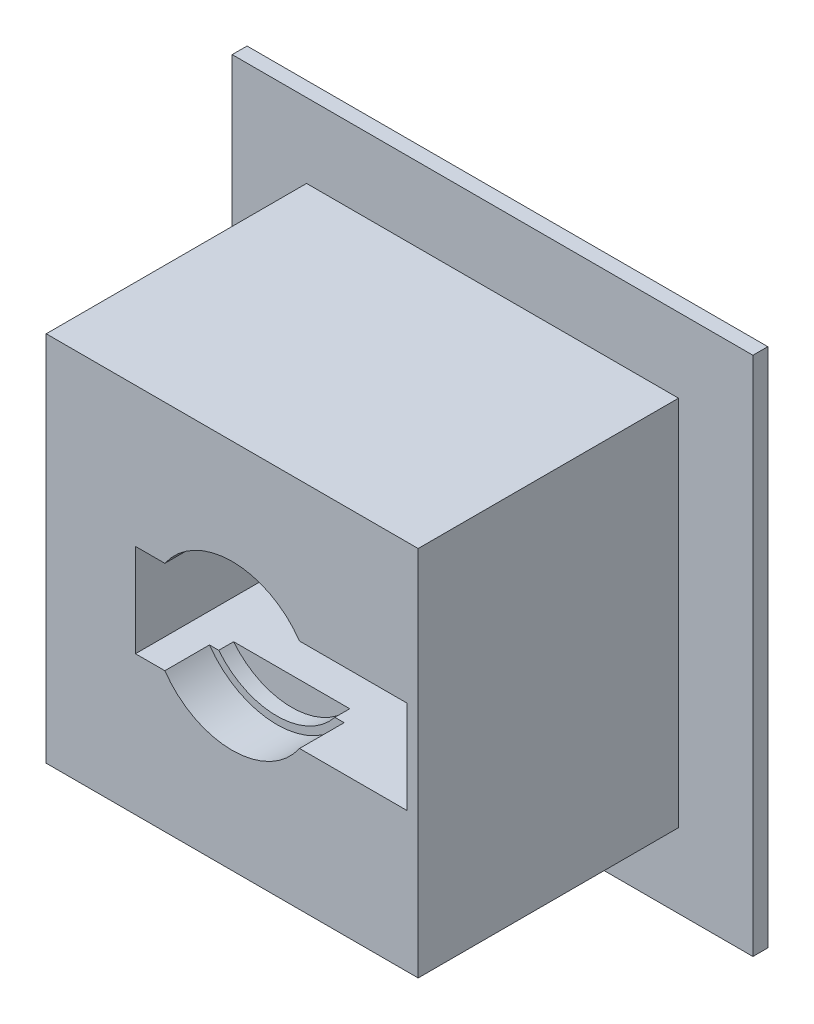
ISO-10303-21;
HEADER;
FILE_DESCRIPTION(('STEP AP214'),'2;1');
FILE_NAME('part.step','',(''),(''),'','','');
FILE_SCHEMA(('AUTOMOTIVE_DESIGN { 1 0 10303 214 1 1 1 1 }'));
ENDSEC;
DATA;
#1=APPLICATION_CONTEXT('core data for automotive mechanical design processes');
#2=APPLICATION_PROTOCOL_DEFINITION('international standard','automotive_design',2000,#1);
#3=PRODUCT_CONTEXT('',#1,'mechanical');
#4=PRODUCT('Part','Part','',(#3));
#5=PRODUCT_RELATED_PRODUCT_CATEGORY('part','',(#4));
#6=PRODUCT_DEFINITION_FORMATION('','',#4);
#7=PRODUCT_DEFINITION_CONTEXT('part definition',#1,'design');
#8=PRODUCT_DEFINITION('design','',#6,#7);
#9=PRODUCT_DEFINITION_SHAPE('','',#8);
#10=(LENGTH_UNIT() NAMED_UNIT(*) SI_UNIT(.MILLI.,.METRE.));
#11=(NAMED_UNIT(*) PLANE_ANGLE_UNIT() SI_UNIT($,.RADIAN.));
#12=(NAMED_UNIT(*) SI_UNIT($,.STERADIAN.) SOLID_ANGLE_UNIT());
#13=UNCERTAINTY_MEASURE_WITH_UNIT(LENGTH_MEASURE(1.E-05),#10,'distance_accuracy_value','');
#14=(GEOMETRIC_REPRESENTATION_CONTEXT(3) GLOBAL_UNCERTAINTY_ASSIGNED_CONTEXT((#13)) GLOBAL_UNIT_ASSIGNED_CONTEXT((#10,
#11,#12)) REPRESENTATION_CONTEXT('',''));
#15=CARTESIAN_POINT('',(0.,0.,0.));
#16=DIRECTION('',(0.,0.,1.));
#17=DIRECTION('',(1.,0.,0.));
#18=AXIS2_PLACEMENT_3D('',#15,#16,#17);
#19=CARTESIAN_POINT('',(27.,-41.25,0.));
#20=DIRECTION('',(-1.,0.,0.));
#21=DIRECTION('',(0.,0.,1.));
#22=AXIS2_PLACEMENT_3D('',#19,#20,#21);
#23=PLANE('',#22);
#24=DIRECTION('',(0.,-1.,0.));
#25=VECTOR('',#24,1.);
#26=CARTESIAN_POINT('',(27.,-41.25,19.));
#27=LINE('',#26,#25);
#28=CARTESIAN_POINT('',(27.,-28.75,19.));
#29=VERTEX_POINT('',#28);
#30=CARTESIAN_POINT('',(27.,-41.25,19.));
#31=VERTEX_POINT('',#30);
#32=EDGE_CURVE('E61',#29,#31,#27,.T.);
#33=ORIENTED_EDGE('',*,*,#32,.T.);
#34=DIRECTION('',(0.,0.,1.));
#35=VECTOR('',#34,1.);
#36=CARTESIAN_POINT('',(27.,-41.25,0.));
#37=LINE('',#36,#35);
#38=CARTESIAN_POINT('',(27.,-41.25,0.));
#39=VERTEX_POINT('',#38);
#40=EDGE_CURVE('E385',#39,#31,#37,.T.);
#41=ORIENTED_EDGE('',*,*,#40,.F.);
#42=DIRECTION('',(0.,-1.,0.));
#43=VECTOR('',#42,1.);
#44=CARTESIAN_POINT('',(27.,-41.25,0.));
#45=LINE('',#44,#43);
#46=CARTESIAN_POINT('',(27.,-37.5115282250192,0.));
#47=VERTEX_POINT('',#46);
#48=EDGE_CURVE('E368',#47,#39,#45,.T.);
#49=ORIENTED_EDGE('',*,*,#48,.F.);
#50=DIRECTION('',(0.,0.,-1.));
#51=VECTOR('',#50,1.);
#52=CARTESIAN_POINT('',(27.,-37.5115282250192,0.));
#53=LINE('',#52,#51);
#54=CARTESIAN_POINT('',(27.,-37.5115282250192,5.));
#55=VERTEX_POINT('',#54);
#56=EDGE_CURVE('E12',#55,#47,#53,.T.);
#57=ORIENTED_EDGE('',*,*,#56,.F.);
#58=DIRECTION('',(0.,-1.,0.));
#59=VECTOR('',#58,1.);
#60=CARTESIAN_POINT('',(27.,-41.25,5.));
#61=LINE('',#60,#59);
#62=CARTESIAN_POINT('',(27.,-32.4884717749808,5.));
#63=VERTEX_POINT('',#62);
#64=EDGE_CURVE('E54',#63,#55,#61,.T.);
#65=ORIENTED_EDGE('',*,*,#64,.F.);
#66=DIRECTION('',(0.,0.,1.));
#67=VECTOR('',#66,1.);
#68=CARTESIAN_POINT('',(27.,-32.4884717749808,0.));
#69=LINE('',#68,#67);
#70=CARTESIAN_POINT('',(27.,-32.4884717749808,0.));
#71=VERTEX_POINT('',#70);
#72=EDGE_CURVE('E543',#71,#63,#69,.T.);
#73=ORIENTED_EDGE('',*,*,#72,.F.);
#74=CARTESIAN_POINT('',(27.,-28.75,0.));
#75=VERTEX_POINT('',#74);
#76=EDGE_CURVE('E369',#75,#71,#45,.T.);
#77=ORIENTED_EDGE('',*,*,#76,.F.);
#78=DIRECTION('',(0.,0.,1.));
#79=VECTOR('',#78,1.);
#80=CARTESIAN_POINT('',(27.,-28.75,0.));
#81=LINE('',#80,#79);
#82=EDGE_CURVE('E389',#75,#29,#81,.T.);
#83=ORIENTED_EDGE('',*,*,#82,.T.);
#84=EDGE_LOOP('',(#33,#41,#49,#57,#65,#73,#77,#83));
#85=FACE_BOUND('',#84,.T.);
#86=ADVANCED_FACE('F45',(#85),#23,.F.);
#87=CARTESIAN_POINT('',(35.,-35.,31.));
#88=DIRECTION('',(0.,0.,1.));
#89=DIRECTION('',(1.,0.,0.));
#90=AXIS2_PLACEMENT_3D('',#87,#88,#89);
#91=CYLINDRICAL_SURFACE('',#90,11.);
#92=CARTESIAN_POINT('',(35.,-35.,37.));
#93=DIRECTION('',(0.,0.,1.));
#94=DIRECTION('',(1.,0.,0.));
#95=AXIS2_PLACEMENT_3D('',#92,#93,#94);
#96=CIRCLE('',#95,11.);
#97=CARTESIAN_POINT('',(44.0519334951158,-28.75,37.));
#98=VERTEX_POINT('',#97);
#99=CARTESIAN_POINT('',(25.9480665048842,-28.75,37.));
#100=VERTEX_POINT('',#99);
#101=EDGE_CURVE('E442',#98,#100,#96,.T.);
#102=ORIENTED_EDGE('',*,*,#101,.T.);
#103=DIRECTION('',(0.,0.,1.));
#104=VECTOR('',#103,1.);
#105=CARTESIAN_POINT('',(25.9480665048841,-28.75,31.));
#106=LINE('',#105,#104);
#107=CARTESIAN_POINT('',(25.9480665048841,-28.75,31.));
#108=VERTEX_POINT('',#107);
#109=EDGE_CURVE('E320',#100,#108,#106,.F.);
#110=ORIENTED_EDGE('',*,*,#109,.T.);
#111=CARTESIAN_POINT('',(35.,-35.,31.));
#112=DIRECTION('',(0.,0.,1.));
#113=DIRECTION('',(1.,0.,0.));
#114=AXIS2_PLACEMENT_3D('',#111,#112,#113);
#115=CIRCLE('',#114,11.);
#116=CARTESIAN_POINT('',(44.0519334951158,-28.75,31.));
#117=VERTEX_POINT('',#116);
#118=EDGE_CURVE('E436',#117,#108,#115,.T.);
#119=ORIENTED_EDGE('',*,*,#118,.F.);
#120=DIRECTION('',(0.,0.,1.));
#121=VECTOR('',#120,1.);
#122=CARTESIAN_POINT('',(44.0519334951158,-28.75,31.));
#123=LINE('',#122,#121);
#124=EDGE_CURVE('E407',#117,#98,#123,.T.);
#125=ORIENTED_EDGE('',*,*,#124,.T.);
#126=EDGE_LOOP('',(#102,#110,#119,#125));
#127=FACE_BOUND('',#126,.T.);
#128=ADVANCED_FACE('F593',(#127),#91,.F.);
#129=CARTESIAN_POINT('',(35.,-35.,31.));
#130=DIRECTION('',(0.,0.,1.));
#131=DIRECTION('',(1.,0.,0.));
#132=AXIS2_PLACEMENT_3D('',#129,#130,#131);
#133=PLANE('',#132);
#134=ORIENTED_EDGE('',*,*,#118,.T.);
#135=DIRECTION('',(-1.,0.,0.));
#136=VECTOR('',#135,1.);
#137=CARTESIAN_POINT('',(35.,-28.75,31.));
#138=LINE('',#137,#136);
#139=CARTESIAN_POINT('',(27.193752502002,-28.75,31.));
#140=VERTEX_POINT('',#139);
#141=EDGE_CURVE('E403',#140,#108,#138,.T.);
#142=ORIENTED_EDGE('',*,*,#141,.F.);
#143=CARTESIAN_POINT('',(35.,-35.,31.));
#144=DIRECTION('',(0.,0.,1.));
#145=DIRECTION('',(1.,0.,0.));
#146=AXIS2_PLACEMENT_3D('',#143,#144,#145);
#147=CIRCLE('',#146,10.);
#148=CARTESIAN_POINT('',(42.806247497998,-28.75,31.));
#149=VERTEX_POINT('',#148);
#150=EDGE_CURVE('E432',#149,#140,#147,.T.);
#151=ORIENTED_EDGE('',*,*,#150,.F.);
#152=EDGE_CURVE('E406',#117,#149,#138,.T.);
#153=ORIENTED_EDGE('',*,*,#152,.F.);
#154=EDGE_LOOP('',(#134,#142,#151,#153));
#155=FACE_BOUND('',#154,.T.);
#156=ADVANCED_FACE('F598',(#155),#133,.T.);
#157=CARTESIAN_POINT('',(53.5,-41.25,0.));
#158=DIRECTION('',(1.,0.,0.));
#159=DIRECTION('',(0.,0.,-1.));
#160=AXIS2_PLACEMENT_3D('',#157,#158,#159);
#161=PLANE('',#160);
#162=DIRECTION('',(0.,1.,0.));
#163=VECTOR('',#162,1.);
#164=CARTESIAN_POINT('',(53.5,-41.25,19.));
#165=LINE('',#164,#163);
#166=CARTESIAN_POINT('',(53.5,-41.25,19.));
#167=VERTEX_POINT('',#166);
#168=CARTESIAN_POINT('',(53.5,-28.75,19.));
#169=VERTEX_POINT('',#168);
#170=EDGE_CURVE('E285',#167,#169,#165,.T.);
#171=ORIENTED_EDGE('',*,*,#170,.T.);
#172=DIRECTION('',(0.,0.,1.));
#173=VECTOR('',#172,1.);
#174=CARTESIAN_POINT('',(53.5,-28.75,0.));
#175=LINE('',#174,#173);
#176=CARTESIAN_POINT('',(53.5,-28.75,0.));
#177=VERTEX_POINT('',#176);
#178=EDGE_CURVE('E377',#177,#169,#175,.T.);
#179=ORIENTED_EDGE('',*,*,#178,.F.);
#180=DIRECTION('',(0.,1.,0.));
#181=VECTOR('',#180,1.);
#182=CARTESIAN_POINT('',(53.5,-41.25,0.));
#183=LINE('',#182,#181);
#184=CARTESIAN_POINT('',(53.5,-41.25,0.));
#185=VERTEX_POINT('',#184);
#186=EDGE_CURVE('E261',#185,#177,#183,.T.);
#187=ORIENTED_EDGE('',*,*,#186,.F.);
#188=DIRECTION('',(0.,0.,1.));
#189=VECTOR('',#188,1.);
#190=CARTESIAN_POINT('',(53.5,-41.25,0.));
#191=LINE('',#190,#189);
#192=EDGE_CURVE('E380',#185,#167,#191,.T.);
#193=ORIENTED_EDGE('',*,*,#192,.T.);
#194=EDGE_LOOP('',(#171,#179,#187,#193));
#195=FACE_BOUND('',#194,.T.);
#196=ADVANCED_FACE('F574',(#195),#161,.F.);
#197=CARTESIAN_POINT('',(0.,-70.,2.));
#198=DIRECTION('',(1.,0.,0.));
#199=DIRECTION('',(0.,1.,0.));
#200=AXIS2_PLACEMENT_3D('',#197,#198,#199);
#201=PLANE('',#200);
#202=DIRECTION('',(0.,0.,1.));
#203=VECTOR('',#202,1.);
#204=CARTESIAN_POINT('',(0.,-37.5115282250192,0.));
#205=LINE('',#204,#203);
#206=CARTESIAN_POINT('',(0.,-37.5115282250192,0.));
#207=VERTEX_POINT('',#206);
#208=CARTESIAN_POINT('',(0.,-37.5115282250192,2.));
#209=VERTEX_POINT('',#208);
#210=EDGE_CURVE('E324',#207,#209,#205,.T.);
#211=ORIENTED_EDGE('',*,*,#210,.F.);
#212=DIRECTION('',(0.,-1.,0.));
#213=VECTOR('',#212,1.);
#214=CARTESIAN_POINT('',(0.,-70.,0.));
#215=LINE('',#214,#213);
#216=CARTESIAN_POINT('',(0.,-70.,0.));
#217=VERTEX_POINT('',#216);
#218=EDGE_CURVE('E515',#207,#217,#215,.T.);
#219=ORIENTED_EDGE('',*,*,#218,.T.);
#220=DIRECTION('',(0.,0.,-1.));
#221=VECTOR('',#220,1.);
#222=CARTESIAN_POINT('',(0.,-70.,2.));
#223=LINE('',#222,#221);
#224=CARTESIAN_POINT('',(0.,-70.,2.));
#225=VERTEX_POINT('',#224);
#226=EDGE_CURVE('E525',#225,#217,#223,.T.);
#227=ORIENTED_EDGE('',*,*,#226,.F.);
#228=DIRECTION('',(0.,-1.,0.));
#229=VECTOR('',#228,1.);
#230=CARTESIAN_POINT('',(0.,-70.,2.));
#231=LINE('',#230,#229);
#232=EDGE_CURVE('E500',#209,#225,#231,.T.);
#233=ORIENTED_EDGE('',*,*,#232,.F.);
#234=EDGE_LOOP('',(#211,#219,#227,#233));
#235=FACE_BOUND('',#234,.T.);
#236=ADVANCED_FACE('F609',(#235),#201,.F.);
#237=DIRECTION('',(0.,0.,-1.));
#238=VECTOR('',#237,1.);
#239=CARTESIAN_POINT('',(0.,-32.4884717749808,0.));
#240=LINE('',#239,#238);
#241=CARTESIAN_POINT('',(0.,-32.4884717749808,2.));
#242=VERTEX_POINT('',#241);
#243=CARTESIAN_POINT('',(0.,-32.4884717749808,0.));
#244=VERTEX_POINT('',#243);
#245=EDGE_CURVE('E327',#242,#244,#240,.T.);
#246=ORIENTED_EDGE('',*,*,#245,.F.);
#247=CARTESIAN_POINT('',(0.,0.,2.));
#248=VERTEX_POINT('',#247);
#249=EDGE_CURVE('E501',#248,#242,#231,.T.);
#250=ORIENTED_EDGE('',*,*,#249,.F.);
#251=DIRECTION('',(0.,0.,-1.));
#252=VECTOR('',#251,1.);
#253=CARTESIAN_POINT('',(0.,0.,2.));
#254=LINE('',#253,#252);
#255=CARTESIAN_POINT('',(0.,0.,0.));
#256=VERTEX_POINT('',#255);
#257=EDGE_CURVE('E529',#248,#256,#254,.T.);
#258=ORIENTED_EDGE('',*,*,#257,.T.);
#259=EDGE_CURVE('E516',#256,#244,#215,.T.);
#260=ORIENTED_EDGE('',*,*,#259,.T.);
#261=EDGE_LOOP('',(#246,#250,#258,#260));
#262=FACE_BOUND('',#261,.T.);
#263=ADVANCED_FACE('F588',(#262),#201,.F.);
#264=CARTESIAN_POINT('',(0.,0.,2.));
#265=DIRECTION('',(0.,0.,1.));
#266=DIRECTION('',(1.,0.,0.));
#267=AXIS2_PLACEMENT_3D('',#264,#265,#266);
#268=PLANE('',#267);
#269=DIRECTION('',(0.,-1.,0.));
#270=VECTOR('',#269,1.);
#271=CARTESIAN_POINT('',(9.99999999999998,-10.,2.));
#272=LINE('',#271,#270);
#273=CARTESIAN_POINT('',(9.99999999999999,-37.5115282250192,2.));
#274=VERTEX_POINT('',#273);
#275=CARTESIAN_POINT('',(9.99999999999999,-60.,2.));
#276=VERTEX_POINT('',#275);
#277=EDGE_CURVE('E440',#274,#276,#272,.T.);
#278=ORIENTED_EDGE('',*,*,#277,.F.);
#279=DIRECTION('',(-1.,0.,0.));
#280=VECTOR('',#279,1.);
#281=CARTESIAN_POINT('',(0.,-37.5115282250192,2.));
#282=LINE('',#281,#280);
#283=EDGE_CURVE('E358',#274,#209,#282,.T.);
#284=ORIENTED_EDGE('',*,*,#283,.T.);
#285=ORIENTED_EDGE('',*,*,#232,.T.);
#286=DIRECTION('',(1.,0.,0.));
#287=VECTOR('',#286,1.);
#288=CARTESIAN_POINT('',(70.,-70.,2.));
#289=LINE('',#288,#287);
#290=CARTESIAN_POINT('',(70.,-70.,2.));
#291=VERTEX_POINT('',#290);
#292=EDGE_CURVE('E505',#225,#291,#289,.T.);
#293=ORIENTED_EDGE('',*,*,#292,.T.);
#294=DIRECTION('',(0.,1.,0.));
#295=VECTOR('',#294,1.);
#296=CARTESIAN_POINT('',(70.,-70.,2.));
#297=LINE('',#296,#295);
#298=CARTESIAN_POINT('',(70.,0.,2.));
#299=VERTEX_POINT('',#298);
#300=EDGE_CURVE('E492',#291,#299,#297,.T.);
#301=ORIENTED_EDGE('',*,*,#300,.T.);
#302=DIRECTION('',(-1.,0.,0.));
#303=VECTOR('',#302,1.);
#304=CARTESIAN_POINT('',(70.,0.,2.));
#305=LINE('',#304,#303);
#306=EDGE_CURVE('E496',#299,#248,#305,.T.);
#307=ORIENTED_EDGE('',*,*,#306,.T.);
#308=ORIENTED_EDGE('',*,*,#249,.T.);
#309=DIRECTION('',(1.,0.,0.));
#310=VECTOR('',#309,1.);
#311=CARTESIAN_POINT('',(0.,-32.4884717749808,2.));
#312=LINE('',#311,#310);
#313=CARTESIAN_POINT('',(9.99999999999999,-32.4884717749808,2.));
#314=VERTEX_POINT('',#313);
#315=EDGE_CURVE('E348',#242,#314,#312,.T.);
#316=ORIENTED_EDGE('',*,*,#315,.T.);
#317=CARTESIAN_POINT('',(9.99999999999998,-10.,2.));
#318=VERTEX_POINT('',#317);
#319=EDGE_CURVE('E461',#318,#314,#272,.T.);
#320=ORIENTED_EDGE('',*,*,#319,.F.);
#321=DIRECTION('',(-1.,0.,0.));
#322=VECTOR('',#321,1.);
#323=CARTESIAN_POINT('',(60.,-10.,2.));
#324=LINE('',#323,#322);
#325=CARTESIAN_POINT('',(60.,-10.,2.));
#326=VERTEX_POINT('',#325);
#327=EDGE_CURVE('E451',#326,#318,#324,.T.);
#328=ORIENTED_EDGE('',*,*,#327,.F.);
#329=DIRECTION('',(0.,1.,0.));
#330=VECTOR('',#329,1.);
#331=CARTESIAN_POINT('',(60.,-10.,2.));
#332=LINE('',#331,#330);
#333=CARTESIAN_POINT('',(60.,-60.,2.));
#334=VERTEX_POINT('',#333);
#335=EDGE_CURVE('E469',#334,#326,#332,.T.);
#336=ORIENTED_EDGE('',*,*,#335,.F.);
#337=DIRECTION('',(1.,0.,0.));
#338=VECTOR('',#337,1.);
#339=CARTESIAN_POINT('',(60.,-60.,2.));
#340=LINE('',#339,#338);
#341=EDGE_CURVE('E465',#276,#334,#340,.T.);
#342=ORIENTED_EDGE('',*,*,#341,.F.);
#343=EDGE_LOOP('',(#278,#284,#285,#293,#301,#307,#308,#316,#320,#328,#336,#342));
#344=FACE_BOUND('',#343,.T.);
#345=ADVANCED_FACE('F579',(#344),#268,.T.);
#346=CARTESIAN_POINT('',(0.,0.,0.));
#347=DIRECTION('',(0.,0.,1.));
#348=DIRECTION('',(1.,0.,0.));
#349=AXIS2_PLACEMENT_3D('',#346,#347,#348);
#350=PLANE('',#349);
#351=DIRECTION('',(1.,0.,0.));
#352=VECTOR('',#351,1.);
#353=CARTESIAN_POINT('',(0.,-37.5115282250192,0.));
#354=LINE('',#353,#352);
#355=EDGE_CURVE('E341',#207,#47,#354,.T.);
#356=ORIENTED_EDGE('',*,*,#355,.T.);
#357=ORIENTED_EDGE('',*,*,#48,.T.);
#358=DIRECTION('',(1.,0.,0.));
#359=VECTOR('',#358,1.);
#360=CARTESIAN_POINT('',(53.5,-41.25,0.));
#361=LINE('',#360,#359);
#362=EDGE_CURVE('E373',#39,#185,#361,.T.);
#363=ORIENTED_EDGE('',*,*,#362,.T.);
#364=ORIENTED_EDGE('',*,*,#186,.T.);
#365=DIRECTION('',(-1.,0.,0.));
#366=VECTOR('',#365,1.);
#367=CARTESIAN_POINT('',(53.5,-28.75,0.));
#368=LINE('',#367,#366);
#369=EDGE_CURVE('E364',#177,#75,#368,.T.);
#370=ORIENTED_EDGE('',*,*,#369,.T.);
#371=ORIENTED_EDGE('',*,*,#76,.T.);
#372=DIRECTION('',(1.,0.,0.));
#373=VECTOR('',#372,1.);
#374=CARTESIAN_POINT('',(0.,-32.4884717749808,0.));
#375=LINE('',#374,#373);
#376=EDGE_CURVE('E330',#244,#71,#375,.T.);
#377=ORIENTED_EDGE('',*,*,#376,.F.);
#378=ORIENTED_EDGE('',*,*,#259,.F.);
#379=DIRECTION('',(-1.,0.,0.));
#380=VECTOR('',#379,1.);
#381=CARTESIAN_POINT('',(70.,0.,0.));
#382=LINE('',#381,#380);
#383=CARTESIAN_POINT('',(70.,0.,0.));
#384=VERTEX_POINT('',#383);
#385=EDGE_CURVE('E512',#384,#256,#382,.T.);
#386=ORIENTED_EDGE('',*,*,#385,.F.);
#387=DIRECTION('',(0.,1.,0.));
#388=VECTOR('',#387,1.);
#389=CARTESIAN_POINT('',(70.,-70.,0.));
#390=LINE('',#389,#388);
#391=CARTESIAN_POINT('',(70.,-70.,0.));
#392=VERTEX_POINT('',#391);
#393=EDGE_CURVE('E491',#392,#384,#390,.T.);
#394=ORIENTED_EDGE('',*,*,#393,.F.);
#395=DIRECTION('',(1.,0.,0.));
#396=VECTOR('',#395,1.);
#397=CARTESIAN_POINT('',(70.,-70.,0.));
#398=LINE('',#397,#396);
#399=EDGE_CURVE('E497',#217,#392,#398,.T.);
#400=ORIENTED_EDGE('',*,*,#399,.F.);
#401=ORIENTED_EDGE('',*,*,#218,.F.);
#402=EDGE_LOOP('',(#356,#357,#363,#364,#370,#371,#377,#378,#386,#394,#400,#401));
#403=FACE_BOUND('',#402,.T.);
#404=ADVANCED_FACE('F575',(#403),#350,.F.);
#405=CARTESIAN_POINT('',(9.99999999999998,-10.,37.));
#406=DIRECTION('',(1.,0.,0.));
#407=DIRECTION('',(0.,1.,0.));
#408=AXIS2_PLACEMENT_3D('',#405,#406,#407);
#409=PLANE('',#408);
#410=DIRECTION('',(0.,0.,1.));
#411=VECTOR('',#410,1.);
#412=CARTESIAN_POINT('',(9.99999999999999,-37.5115282250192,37.));
#413=LINE('',#412,#411);
#414=CARTESIAN_POINT('',(9.99999999999999,-37.5115282250192,5.));
#415=VERTEX_POINT('',#414);
#416=EDGE_CURVE('E355',#274,#415,#413,.T.);
#417=ORIENTED_EDGE('',*,*,#416,.F.);
#418=ORIENTED_EDGE('',*,*,#277,.T.);
#419=DIRECTION('',(0.,0.,-1.));
#420=VECTOR('',#419,1.);
#421=CARTESIAN_POINT('',(9.99999999999999,-60.,37.));
#422=LINE('',#421,#420);
#423=CARTESIAN_POINT('',(9.99999999999999,-60.,37.));
#424=VERTEX_POINT('',#423);
#425=EDGE_CURVE('E487',#424,#276,#422,.T.);
#426=ORIENTED_EDGE('',*,*,#425,.F.);
#427=DIRECTION('',(0.,-1.,0.));
#428=VECTOR('',#427,1.);
#429=CARTESIAN_POINT('',(9.99999999999998,-10.,37.));
#430=LINE('',#429,#428);
#431=CARTESIAN_POINT('',(9.99999999999998,-10.,37.));
#432=VERTEX_POINT('',#431);
#433=EDGE_CURVE('E446',#432,#424,#430,.T.);
#434=ORIENTED_EDGE('',*,*,#433,.F.);
#435=DIRECTION('',(0.,0.,-1.));
#436=VECTOR('',#435,1.);
#437=CARTESIAN_POINT('',(9.99999999999998,-10.,37.));
#438=LINE('',#437,#436);
#439=EDGE_CURVE('E460',#432,#318,#438,.T.);
#440=ORIENTED_EDGE('',*,*,#439,.T.);
#441=ORIENTED_EDGE('',*,*,#319,.T.);
#442=DIRECTION('',(0.,0.,-1.));
#443=VECTOR('',#442,1.);
#444=CARTESIAN_POINT('',(9.99999999999999,-32.4884717749808,37.));
#445=LINE('',#444,#443);
#446=CARTESIAN_POINT('',(9.99999999999999,-32.4884717749808,5.));
#447=VERTEX_POINT('',#446);
#448=EDGE_CURVE('E345',#447,#314,#445,.T.);
#449=ORIENTED_EDGE('',*,*,#448,.F.);
#450=DIRECTION('',(0.,1.,0.));
#451=VECTOR('',#450,1.);
#452=CARTESIAN_POINT('',(9.99999999999998,-10.,5.));
#453=LINE('',#452,#451);
#454=EDGE_CURVE('E352',#415,#447,#453,.T.);
#455=ORIENTED_EDGE('',*,*,#454,.F.);
#456=EDGE_LOOP('',(#417,#418,#426,#434,#440,#441,#449,#455));
#457=FACE_BOUND('',#456,.T.);
#458=ADVANCED_FACE('F578',(#457),#409,.F.);
#459=CARTESIAN_POINT('',(35.,-35.,29.));
#460=DIRECTION('',(0.,0.,1.));
#461=DIRECTION('',(1.,0.,0.));
#462=AXIS2_PLACEMENT_3D('',#459,#460,#461);
#463=CYLINDRICAL_SURFACE('',#462,10.);
#464=CARTESIAN_POINT('',(27.193752502002,-41.25,31.));
#465=VERTEX_POINT('',#464);
#466=CARTESIAN_POINT('',(42.806247497998,-41.25,31.));
#467=VERTEX_POINT('',#466);
#468=EDGE_CURVE('E425',#465,#467,#147,.T.);
#469=ORIENTED_EDGE('',*,*,#468,.T.);
#470=DIRECTION('',(0.,0.,1.));
#471=VECTOR('',#470,1.);
#472=CARTESIAN_POINT('',(42.806247497998,-41.25,29.));
#473=LINE('',#472,#471);
#474=CARTESIAN_POINT('',(42.806247497998,-41.25,29.));
#475=VERTEX_POINT('',#474);
#476=EDGE_CURVE('E415',#467,#475,#473,.F.);
#477=ORIENTED_EDGE('',*,*,#476,.T.);
#478=CARTESIAN_POINT('',(35.,-35.,29.));
#479=DIRECTION('',(0.,0.,1.));
#480=DIRECTION('',(1.,0.,0.));
#481=AXIS2_PLACEMENT_3D('',#478,#479,#480);
#482=CIRCLE('',#481,10.);
#483=CARTESIAN_POINT('',(27.193752502002,-41.25,29.));
#484=VERTEX_POINT('',#483);
#485=EDGE_CURVE('E431',#484,#475,#482,.T.);
#486=ORIENTED_EDGE('',*,*,#485,.F.);
#487=DIRECTION('',(0.,0.,1.));
#488=VECTOR('',#487,1.);
#489=CARTESIAN_POINT('',(27.193752502002,-41.25,29.));
#490=LINE('',#489,#488);
#491=EDGE_CURVE('E411',#484,#465,#490,.T.);
#492=ORIENTED_EDGE('',*,*,#491,.T.);
#493=EDGE_LOOP('',(#469,#477,#486,#492));
#494=FACE_BOUND('',#493,.T.);
#495=ADVANCED_FACE('F585',(#494),#463,.F.);
#496=CARTESIAN_POINT('',(35.,-35.,29.));
#497=DIRECTION('',(0.,0.,1.));
#498=DIRECTION('',(1.,0.,0.));
#499=AXIS2_PLACEMENT_3D('',#496,#497,#498);
#500=PLANE('',#499);
#501=DIRECTION('',(1.,0.,0.));
#502=VECTOR('',#501,1.);
#503=CARTESIAN_POINT('',(35.,-41.25,29.));
#504=LINE('',#503,#502);
#505=EDGE_CURVE('E540',#484,#475,#504,.T.);
#506=ORIENTED_EDGE('',*,*,#505,.F.);
#507=ORIENTED_EDGE('',*,*,#485,.T.);
#508=EDGE_LOOP('',(#506,#507));
#509=FACE_BOUND('',#508,.T.);
#510=ADVANCED_FACE('F615',(#509),#500,.T.);
#511=CARTESIAN_POINT('',(70.,-70.,2.));
#512=DIRECTION('',(-1.,0.,0.));
#513=DIRECTION('',(0.,0.,1.));
#514=AXIS2_PLACEMENT_3D('',#511,#512,#513);
#515=PLANE('',#514);
#516=ORIENTED_EDGE('',*,*,#393,.T.);
#517=DIRECTION('',(0.,0.,-1.));
#518=VECTOR('',#517,1.);
#519=CARTESIAN_POINT('',(70.,0.,2.));
#520=LINE('',#519,#518);
#521=EDGE_CURVE('E533',#299,#384,#520,.T.);
#522=ORIENTED_EDGE('',*,*,#521,.F.);
#523=ORIENTED_EDGE('',*,*,#300,.F.);
#524=DIRECTION('',(0.,0.,-1.));
#525=VECTOR('',#524,1.);
#526=CARTESIAN_POINT('',(70.,-70.,2.));
#527=LINE('',#526,#525);
#528=EDGE_CURVE('E508',#291,#392,#527,.T.);
#529=ORIENTED_EDGE('',*,*,#528,.T.);
#530=EDGE_LOOP('',(#516,#522,#523,#529));
#531=FACE_BOUND('',#530,.T.);
#532=ADVANCED_FACE('F47',(#531),#515,.F.);
#533=CARTESIAN_POINT('',(70.,0.,2.));
#534=DIRECTION('',(0.,-1.,0.));
#535=DIRECTION('',(1.,0.,0.));
#536=AXIS2_PLACEMENT_3D('',#533,#534,#535);
#537=PLANE('',#536);
#538=ORIENTED_EDGE('',*,*,#385,.T.);
#539=ORIENTED_EDGE('',*,*,#257,.F.);
#540=ORIENTED_EDGE('',*,*,#306,.F.);
#541=ORIENTED_EDGE('',*,*,#521,.T.);
#542=EDGE_LOOP('',(#538,#539,#540,#541));
#543=FACE_BOUND('',#542,.T.);
#544=ADVANCED_FACE('F642',(#543),#537,.F.);
#545=CARTESIAN_POINT('',(70.,-70.,2.));
#546=DIRECTION('',(0.,1.,0.));
#547=DIRECTION('',(0.,0.,1.));
#548=AXIS2_PLACEMENT_3D('',#545,#546,#547);
#549=PLANE('',#548);
#550=ORIENTED_EDGE('',*,*,#399,.T.);
#551=ORIENTED_EDGE('',*,*,#528,.F.);
#552=ORIENTED_EDGE('',*,*,#292,.F.);
#553=ORIENTED_EDGE('',*,*,#226,.T.);
#554=EDGE_LOOP('',(#550,#551,#552,#553));
#555=FACE_BOUND('',#554,.T.);
#556=ADVANCED_FACE('F637',(#555),#549,.F.);
#557=CARTESIAN_POINT('',(60.,-60.,37.));
#558=DIRECTION('',(0.,1.,0.));
#559=DIRECTION('',(-1.,0.,0.));
#560=AXIS2_PLACEMENT_3D('',#557,#558,#559);
#561=PLANE('',#560);
#562=ORIENTED_EDGE('',*,*,#341,.T.);
#563=DIRECTION('',(0.,0.,-1.));
#564=VECTOR('',#563,1.);
#565=CARTESIAN_POINT('',(60.,-60.,37.));
#566=LINE('',#565,#564);
#567=CARTESIAN_POINT('',(60.,-60.,37.));
#568=VERTEX_POINT('',#567);
#569=EDGE_CURVE('E483',#568,#334,#566,.T.);
#570=ORIENTED_EDGE('',*,*,#569,.F.);
#571=DIRECTION('',(1.,0.,0.));
#572=VECTOR('',#571,1.);
#573=CARTESIAN_POINT('',(60.,-60.,37.));
#574=LINE('',#573,#572);
#575=EDGE_CURVE('E450',#424,#568,#574,.T.);
#576=ORIENTED_EDGE('',*,*,#575,.F.);
#577=ORIENTED_EDGE('',*,*,#425,.T.);
#578=EDGE_LOOP('',(#562,#570,#576,#577));
#579=FACE_BOUND('',#578,.T.);
#580=ADVANCED_FACE('F634',(#579),#561,.F.);
#581=CARTESIAN_POINT('',(60.,-10.,37.));
#582=DIRECTION('',(-1.,0.,0.));
#583=DIRECTION('',(0.,-1.,0.));
#584=AXIS2_PLACEMENT_3D('',#581,#582,#583);
#585=PLANE('',#584);
#586=ORIENTED_EDGE('',*,*,#335,.T.);
#587=DIRECTION('',(0.,0.,-1.));
#588=VECTOR('',#587,1.);
#589=CARTESIAN_POINT('',(60.,-10.,37.));
#590=LINE('',#589,#588);
#591=CARTESIAN_POINT('',(60.,-10.,37.));
#592=VERTEX_POINT('',#591);
#593=EDGE_CURVE('E479',#592,#326,#590,.T.);
#594=ORIENTED_EDGE('',*,*,#593,.F.);
#595=DIRECTION('',(0.,1.,0.));
#596=VECTOR('',#595,1.);
#597=CARTESIAN_POINT('',(60.,-10.,37.));
#598=LINE('',#597,#596);
#599=EDGE_CURVE('E454',#568,#592,#598,.T.);
#600=ORIENTED_EDGE('',*,*,#599,.F.);
#601=ORIENTED_EDGE('',*,*,#569,.T.);
#602=EDGE_LOOP('',(#586,#594,#600,#601));
#603=FACE_BOUND('',#602,.T.);
#604=ADVANCED_FACE('F630',(#603),#585,.F.);
#605=CARTESIAN_POINT('',(60.,-10.,37.));
#606=DIRECTION('',(0.,-1.,0.));
#607=DIRECTION('',(1.,0.,0.));
#608=AXIS2_PLACEMENT_3D('',#605,#606,#607);
#609=PLANE('',#608);
#610=ORIENTED_EDGE('',*,*,#327,.T.);
#611=ORIENTED_EDGE('',*,*,#439,.F.);
#612=DIRECTION('',(-1.,0.,0.));
#613=VECTOR('',#612,1.);
#614=CARTESIAN_POINT('',(60.,-10.,37.));
#615=LINE('',#614,#613);
#616=EDGE_CURVE('E457',#592,#432,#615,.T.);
#617=ORIENTED_EDGE('',*,*,#616,.F.);
#618=ORIENTED_EDGE('',*,*,#593,.T.);
#619=EDGE_LOOP('',(#610,#611,#617,#618));
#620=FACE_BOUND('',#619,.T.);
#621=ADVANCED_FACE('F627',(#620),#609,.F.);
#622=CARTESIAN_POINT('',(0.,0.,37.));
#623=DIRECTION('',(0.,0.,-1.));
#624=DIRECTION('',(-1.,0.,0.));
#625=AXIS2_PLACEMENT_3D('',#622,#623,#624);
#626=PLANE('',#625);
#627=DIRECTION('',(-1.,0.,0.));
#628=VECTOR('',#627,1.);
#629=CARTESIAN_POINT('',(53.5,-28.75,37.));
#630=LINE('',#629,#628);
#631=CARTESIAN_POINT('',(58.5,-28.75,37.));
#632=VERTEX_POINT('',#631);
#633=EDGE_CURVE('E262',#632,#98,#630,.T.);
#634=ORIENTED_EDGE('',*,*,#633,.F.);
#635=DIRECTION('',(0.,1.,0.));
#636=VECTOR('',#635,1.);
#637=CARTESIAN_POINT('',(58.5,-41.25,37.));
#638=LINE('',#637,#636);
#639=CARTESIAN_POINT('',(58.5,-41.25,37.));
#640=VERTEX_POINT('',#639);
#641=EDGE_CURVE('E268',#640,#632,#638,.T.);
#642=ORIENTED_EDGE('',*,*,#641,.F.);
#643=DIRECTION('',(1.,0.,0.));
#644=VECTOR('',#643,1.);
#645=CARTESIAN_POINT('',(53.5,-41.25,37.));
#646=LINE('',#645,#644);
#647=CARTESIAN_POINT('',(44.0519334951158,-41.25,37.));
#648=VERTEX_POINT('',#647);
#649=EDGE_CURVE('E249',#648,#640,#646,.T.);
#650=ORIENTED_EDGE('',*,*,#649,.F.);
#651=CARTESIAN_POINT('',(25.9480665048842,-41.25,37.));
#652=VERTEX_POINT('',#651);
#653=EDGE_CURVE('E430',#652,#648,#96,.T.);
#654=ORIENTED_EDGE('',*,*,#653,.F.);
#655=DIRECTION('',(1.,0.,0.));
#656=VECTOR('',#655,1.);
#657=CARTESIAN_POINT('',(22.,-41.25,37.));
#658=LINE('',#657,#656);
#659=CARTESIAN_POINT('',(22.,-41.25,37.));
#660=VERTEX_POINT('',#659);
#661=EDGE_CURVE('E305',#660,#652,#658,.T.);
#662=ORIENTED_EDGE('',*,*,#661,.F.);
#663=DIRECTION('',(0.,-1.,0.));
#664=VECTOR('',#663,1.);
#665=CARTESIAN_POINT('',(22.,-41.25,37.));
#666=LINE('',#665,#664);
#667=CARTESIAN_POINT('',(22.,-28.75,37.));
#668=VERTEX_POINT('',#667);
#669=EDGE_CURVE('E301',#668,#660,#666,.T.);
#670=ORIENTED_EDGE('',*,*,#669,.F.);
#671=DIRECTION('',(-1.,0.,0.));
#672=VECTOR('',#671,1.);
#673=CARTESIAN_POINT('',(22.,-28.75,37.));
#674=LINE('',#673,#672);
#675=EDGE_CURVE('E308',#100,#668,#674,.T.);
#676=ORIENTED_EDGE('',*,*,#675,.F.);
#677=ORIENTED_EDGE('',*,*,#101,.F.);
#678=EDGE_LOOP('',(#634,#642,#650,#654,#662,#670,#676,#677));
#679=FACE_BOUND('',#678,.T.);
#680=ORIENTED_EDGE('',*,*,#433,.T.);
#681=ORIENTED_EDGE('',*,*,#575,.T.);
#682=ORIENTED_EDGE('',*,*,#599,.T.);
#683=ORIENTED_EDGE('',*,*,#616,.T.);
#684=EDGE_LOOP('',(#680,#681,#682,#683));
#685=FACE_BOUND('',#684,.T.);
#686=ADVANCED_FACE('F273',(#679,#685),#626,.F.);
#687=CARTESIAN_POINT('',(25.9480665048841,-41.25,31.));
#688=VERTEX_POINT('',#687);
#689=CARTESIAN_POINT('',(44.0519334951158,-41.25,31.));
#690=VERTEX_POINT('',#689);
#691=EDGE_CURVE('E441',#688,#690,#115,.T.);
#692=ORIENTED_EDGE('',*,*,#691,.F.);
#693=DIRECTION('',(0.,0.,1.));
#694=VECTOR('',#693,1.);
#695=CARTESIAN_POINT('',(25.9480665048841,-41.25,31.));
#696=LINE('',#695,#694);
#697=EDGE_CURVE('E292',#688,#652,#696,.T.);
#698=ORIENTED_EDGE('',*,*,#697,.T.);
#699=ORIENTED_EDGE('',*,*,#653,.T.);
#700=DIRECTION('',(0.,0.,1.));
#701=VECTOR('',#700,1.);
#702=CARTESIAN_POINT('',(44.0519334951158,-41.25,31.));
#703=LINE('',#702,#701);
#704=EDGE_CURVE('E256',#648,#690,#703,.F.);
#705=ORIENTED_EDGE('',*,*,#704,.T.);
#706=EDGE_LOOP('',(#692,#698,#699,#705));
#707=FACE_BOUND('',#706,.T.);
#708=ADVANCED_FACE('F601',(#707),#91,.F.);
#709=DIRECTION('',(1.,0.,0.));
#710=VECTOR('',#709,1.);
#711=CARTESIAN_POINT('',(35.,-41.25,31.));
#712=LINE('',#711,#710);
#713=EDGE_CURVE('E422',#688,#465,#712,.T.);
#714=ORIENTED_EDGE('',*,*,#713,.F.);
#715=ORIENTED_EDGE('',*,*,#691,.T.);
#716=EDGE_CURVE('E419',#467,#690,#712,.T.);
#717=ORIENTED_EDGE('',*,*,#716,.F.);
#718=ORIENTED_EDGE('',*,*,#468,.F.);
#719=EDGE_LOOP('',(#714,#715,#717,#718));
#720=FACE_BOUND('',#719,.T.);
#721=ADVANCED_FACE('F618',(#720),#133,.T.);
#722=ORIENTED_EDGE('',*,*,#150,.T.);
#723=DIRECTION('',(0.,0.,1.));
#724=VECTOR('',#723,1.);
#725=CARTESIAN_POINT('',(27.193752502002,-28.75,29.));
#726=LINE('',#725,#724);
#727=CARTESIAN_POINT('',(27.193752502002,-28.75,29.));
#728=VERTEX_POINT('',#727);
#729=EDGE_CURVE('E399',#140,#728,#726,.F.);
#730=ORIENTED_EDGE('',*,*,#729,.T.);
#731=CARTESIAN_POINT('',(42.806247497998,-28.75,29.));
#732=VERTEX_POINT('',#731);
#733=EDGE_CURVE('E426',#732,#728,#482,.T.);
#734=ORIENTED_EDGE('',*,*,#733,.F.);
#735=DIRECTION('',(0.,0.,1.));
#736=VECTOR('',#735,1.);
#737=CARTESIAN_POINT('',(42.806247497998,-28.75,29.));
#738=LINE('',#737,#736);
#739=EDGE_CURVE('E384',#732,#149,#738,.T.);
#740=ORIENTED_EDGE('',*,*,#739,.T.);
#741=EDGE_LOOP('',(#722,#730,#734,#740));
#742=FACE_BOUND('',#741,.T.);
#743=ADVANCED_FACE('F613',(#742),#463,.F.);
#744=DIRECTION('',(-1.,0.,0.));
#745=VECTOR('',#744,1.);
#746=CARTESIAN_POINT('',(35.,-28.75,29.));
#747=LINE('',#746,#745);
#748=EDGE_CURVE('E537',#732,#728,#747,.T.);
#749=ORIENTED_EDGE('',*,*,#748,.F.);
#750=ORIENTED_EDGE('',*,*,#733,.T.);
#751=EDGE_LOOP('',(#749,#750));
#752=FACE_BOUND('',#751,.T.);
#753=ADVANCED_FACE('F610',(#752),#500,.T.);
#754=CARTESIAN_POINT('',(53.5,-41.25,0.));
#755=DIRECTION('',(0.,-1.,0.));
#756=DIRECTION('',(1.,0.,0.));
#757=AXIS2_PLACEMENT_3D('',#754,#755,#756);
#758=PLANE('',#757);
#759=ORIENTED_EDGE('',*,*,#649,.T.);
#760=DIRECTION('',(0.,0.,1.));
#761=VECTOR('',#760,1.);
#762=CARTESIAN_POINT('',(58.5,-41.25,-6.46291201783626));
#763=LINE('',#762,#761);
#764=CARTESIAN_POINT('',(58.5,-41.25,19.));
#765=VERTEX_POINT('',#764);
#766=EDGE_CURVE('E252',#765,#640,#763,.T.);
#767=ORIENTED_EDGE('',*,*,#766,.F.);
#768=DIRECTION('',(-1.,0.,0.));
#769=VECTOR('',#768,1.);
#770=CARTESIAN_POINT('',(53.5,-41.25,19.));
#771=LINE('',#770,#769);
#772=EDGE_CURVE('E289',#765,#167,#771,.T.);
#773=ORIENTED_EDGE('',*,*,#772,.T.);
#774=ORIENTED_EDGE('',*,*,#192,.F.);
#775=ORIENTED_EDGE('',*,*,#362,.F.);
#776=ORIENTED_EDGE('',*,*,#40,.T.);
#777=DIRECTION('',(-1.,0.,0.));
#778=VECTOR('',#777,1.);
#779=CARTESIAN_POINT('',(22.,-41.25,19.));
#780=LINE('',#779,#778);
#781=CARTESIAN_POINT('',(22.,-41.25,19.));
#782=VERTEX_POINT('',#781);
#783=EDGE_CURVE('E278',#31,#782,#780,.T.);
#784=ORIENTED_EDGE('',*,*,#783,.T.);
#785=DIRECTION('',(0.,0.,1.));
#786=VECTOR('',#785,1.);
#787=CARTESIAN_POINT('',(22.,-41.25,-6.46291201783626));
#788=LINE('',#787,#786);
#789=EDGE_CURVE('E311',#782,#660,#788,.T.);
#790=ORIENTED_EDGE('',*,*,#789,.T.);
#791=ORIENTED_EDGE('',*,*,#661,.T.);
#792=ORIENTED_EDGE('',*,*,#697,.F.);
#793=ORIENTED_EDGE('',*,*,#713,.T.);
#794=ORIENTED_EDGE('',*,*,#491,.F.);
#795=ORIENTED_EDGE('',*,*,#505,.T.);
#796=ORIENTED_EDGE('',*,*,#476,.F.);
#797=ORIENTED_EDGE('',*,*,#716,.T.);
#798=ORIENTED_EDGE('',*,*,#704,.F.);
#799=EDGE_LOOP('',(#759,#767,#773,#774,#775,#776,#784,#790,#791,#792,#793,#794,#795,#796,#797,#798));
#800=FACE_BOUND('',#799,.T.);
#801=ADVANCED_FACE('F251',(#800),#758,.F.);
#802=CARTESIAN_POINT('',(53.5,-28.75,0.));
#803=DIRECTION('',(0.,1.,0.));
#804=DIRECTION('',(-1.,0.,0.));
#805=AXIS2_PLACEMENT_3D('',#802,#803,#804);
#806=PLANE('',#805);
#807=ORIENTED_EDGE('',*,*,#152,.T.);
#808=ORIENTED_EDGE('',*,*,#739,.F.);
#809=ORIENTED_EDGE('',*,*,#748,.T.);
#810=ORIENTED_EDGE('',*,*,#729,.F.);
#811=ORIENTED_EDGE('',*,*,#141,.T.);
#812=ORIENTED_EDGE('',*,*,#109,.F.);
#813=ORIENTED_EDGE('',*,*,#675,.T.);
#814=DIRECTION('',(0.,0.,1.));
#815=VECTOR('',#814,1.);
#816=CARTESIAN_POINT('',(22.,-28.75,-6.46291201783626));
#817=LINE('',#816,#815);
#818=CARTESIAN_POINT('',(22.,-28.75,19.));
#819=VERTEX_POINT('',#818);
#820=EDGE_CURVE('E296',#819,#668,#817,.T.);
#821=ORIENTED_EDGE('',*,*,#820,.F.);
#822=DIRECTION('',(1.,0.,0.));
#823=VECTOR('',#822,1.);
#824=CARTESIAN_POINT('',(22.,-28.75,19.));
#825=LINE('',#824,#823);
#826=EDGE_CURVE('E295',#819,#29,#825,.T.);
#827=ORIENTED_EDGE('',*,*,#826,.T.);
#828=ORIENTED_EDGE('',*,*,#82,.F.);
#829=ORIENTED_EDGE('',*,*,#369,.F.);
#830=ORIENTED_EDGE('',*,*,#178,.T.);
#831=DIRECTION('',(1.,0.,0.));
#832=VECTOR('',#831,1.);
#833=CARTESIAN_POINT('',(53.5,-28.75,19.));
#834=LINE('',#833,#832);
#835=CARTESIAN_POINT('',(58.5,-28.75,19.));
#836=VERTEX_POINT('',#835);
#837=EDGE_CURVE('E69',#169,#836,#834,.T.);
#838=ORIENTED_EDGE('',*,*,#837,.T.);
#839=DIRECTION('',(0.,0.,1.));
#840=VECTOR('',#839,1.);
#841=CARTESIAN_POINT('',(58.5,-28.75,-6.46291201783626));
#842=LINE('',#841,#840);
#843=EDGE_CURVE('E271',#836,#632,#842,.T.);
#844=ORIENTED_EDGE('',*,*,#843,.T.);
#845=ORIENTED_EDGE('',*,*,#633,.T.);
#846=ORIENTED_EDGE('',*,*,#124,.F.);
#847=EDGE_LOOP('',(#807,#808,#809,#810,#811,#812,#813,#821,#827,#828,#829,#830,#838,#844,#845,#846));
#848=FACE_BOUND('',#847,.T.);
#849=ADVANCED_FACE('F568',(#848),#806,.F.);
#850=CARTESIAN_POINT('',(0.,-37.5115282250192,0.));
#851=DIRECTION('',(0.,1.,0.));
#852=DIRECTION('',(0.,0.,1.));
#853=AXIS2_PLACEMENT_3D('',#850,#851,#852);
#854=PLANE('',#853);
#855=ORIENTED_EDGE('',*,*,#416,.T.);
#856=DIRECTION('',(1.,0.,0.));
#857=VECTOR('',#856,1.);
#858=CARTESIAN_POINT('',(0.,-37.5115282250192,5.));
#859=LINE('',#858,#857);
#860=EDGE_CURVE('E337',#415,#55,#859,.T.);
#861=ORIENTED_EDGE('',*,*,#860,.T.);
#862=ORIENTED_EDGE('',*,*,#56,.T.);
#863=ORIENTED_EDGE('',*,*,#355,.F.);
#864=ORIENTED_EDGE('',*,*,#210,.T.);
#865=ORIENTED_EDGE('',*,*,#283,.F.);
#866=EDGE_LOOP('',(#855,#861,#862,#863,#864,#865));
#867=FACE_BOUND('',#866,.T.);
#868=ADVANCED_FACE('F556',(#867),#854,.T.);
#869=CARTESIAN_POINT('',(0.,-37.5115282250192,5.));
#870=DIRECTION('',(0.,0.,-1.));
#871=DIRECTION('',(-1.,0.,0.));
#872=AXIS2_PLACEMENT_3D('',#869,#870,#871);
#873=PLANE('',#872);
#874=ORIENTED_EDGE('',*,*,#454,.T.);
#875=DIRECTION('',(1.,0.,0.));
#876=VECTOR('',#875,1.);
#877=CARTESIAN_POINT('',(0.,-32.4884717749808,5.));
#878=LINE('',#877,#876);
#879=EDGE_CURVE('E333',#447,#63,#878,.T.);
#880=ORIENTED_EDGE('',*,*,#879,.T.);
#881=ORIENTED_EDGE('',*,*,#64,.T.);
#882=ORIENTED_EDGE('',*,*,#860,.F.);
#883=EDGE_LOOP('',(#874,#880,#881,#882));
#884=FACE_BOUND('',#883,.T.);
#885=ADVANCED_FACE('F549',(#884),#873,.T.);
#886=CARTESIAN_POINT('',(0.,-32.4884717749808,0.));
#887=DIRECTION('',(0.,-1.,0.));
#888=DIRECTION('',(0.,0.,-1.));
#889=AXIS2_PLACEMENT_3D('',#886,#887,#888);
#890=PLANE('',#889);
#891=ORIENTED_EDGE('',*,*,#245,.T.);
#892=ORIENTED_EDGE('',*,*,#376,.T.);
#893=ORIENTED_EDGE('',*,*,#72,.T.);
#894=ORIENTED_EDGE('',*,*,#879,.F.);
#895=ORIENTED_EDGE('',*,*,#448,.T.);
#896=ORIENTED_EDGE('',*,*,#315,.F.);
#897=EDGE_LOOP('',(#891,#892,#893,#894,#895,#896));
#898=FACE_BOUND('',#897,.T.);
#899=ADVANCED_FACE('F701',(#898),#890,.T.);
#900=CARTESIAN_POINT('',(58.5,-41.25,-6.46291201783626));
#901=DIRECTION('',(1.,0.,0.));
#902=DIRECTION('',(0.,0.,-1.));
#903=AXIS2_PLACEMENT_3D('',#900,#901,#902);
#904=PLANE('',#903);
#905=DIRECTION('',(0.,-1.,0.));
#906=VECTOR('',#905,1.);
#907=CARTESIAN_POINT('',(58.5,-41.25,19.));
#908=LINE('',#907,#906);
#909=EDGE_CURVE('E269',#836,#765,#908,.T.);
#910=ORIENTED_EDGE('',*,*,#909,.T.);
#911=ORIENTED_EDGE('',*,*,#766,.T.);
#912=ORIENTED_EDGE('',*,*,#641,.T.);
#913=ORIENTED_EDGE('',*,*,#843,.F.);
#914=EDGE_LOOP('',(#910,#911,#912,#913));
#915=FACE_BOUND('',#914,.T.);
#916=ADVANCED_FACE('F266',(#915),#904,.F.);
#917=CARTESIAN_POINT('',(35.,-35.,19.));
#918=DIRECTION('',(0.,0.,1.));
#919=DIRECTION('',(1.,0.,0.));
#920=AXIS2_PLACEMENT_3D('',#917,#918,#919);
#921=PLANE('',#920);
#922=ORIENTED_EDGE('',*,*,#170,.F.);
#923=ORIENTED_EDGE('',*,*,#772,.F.);
#924=ORIENTED_EDGE('',*,*,#909,.F.);
#925=ORIENTED_EDGE('',*,*,#837,.F.);
#926=EDGE_LOOP('',(#922,#923,#924,#925));
#927=FACE_BOUND('',#926,.T.);
#928=ADVANCED_FACE('F571',(#927),#921,.T.);
#929=CARTESIAN_POINT('',(22.,-41.25,-6.46291201783626));
#930=DIRECTION('',(-1.,0.,0.));
#931=DIRECTION('',(0.,0.,1.));
#932=AXIS2_PLACEMENT_3D('',#929,#930,#931);
#933=PLANE('',#932);
#934=DIRECTION('',(0.,1.,0.));
#935=VECTOR('',#934,1.);
#936=CARTESIAN_POINT('',(22.,-41.25,19.));
#937=LINE('',#936,#935);
#938=EDGE_CURVE('E281',#782,#819,#937,.T.);
#939=ORIENTED_EDGE('',*,*,#938,.T.);
#940=ORIENTED_EDGE('',*,*,#820,.T.);
#941=ORIENTED_EDGE('',*,*,#669,.T.);
#942=ORIENTED_EDGE('',*,*,#789,.F.);
#943=EDGE_LOOP('',(#939,#940,#941,#942));
#944=FACE_BOUND('',#943,.T.);
#945=ADVANCED_FACE('F674',(#944),#933,.F.);
#946=CARTESIAN_POINT('',(35.,-35.,19.));
#947=DIRECTION('',(0.,0.,1.));
#948=DIRECTION('',(1.,0.,0.));
#949=AXIS2_PLACEMENT_3D('',#946,#947,#948);
#950=PLANE('',#949);
#951=ORIENTED_EDGE('',*,*,#938,.F.);
#952=ORIENTED_EDGE('',*,*,#783,.F.);
#953=ORIENTED_EDGE('',*,*,#32,.F.);
#954=ORIENTED_EDGE('',*,*,#826,.F.);
#955=EDGE_LOOP('',(#951,#952,#953,#954));
#956=FACE_BOUND('',#955,.T.);
#957=ADVANCED_FACE('F677',(#956),#950,.T.);
#958=CLOSED_SHELL('',(#86,#128,#156,#196,#236,#263,#345,#404,#458,#495,#510,#532,#544,#556,#580,
#604,#621,#686,#708,#721,#743,#753,#801,#849,#868,#885,#899,#916,#928,#945,#957));
#959=MANIFOLD_SOLID_BREP('B2',#958);
#960=ADVANCED_BREP_SHAPE_REPRESENTATION('',(#18,#959),#14);
#961=SHAPE_DEFINITION_REPRESENTATION(#9,#960);
ENDSEC;
END-ISO-10303-21;
